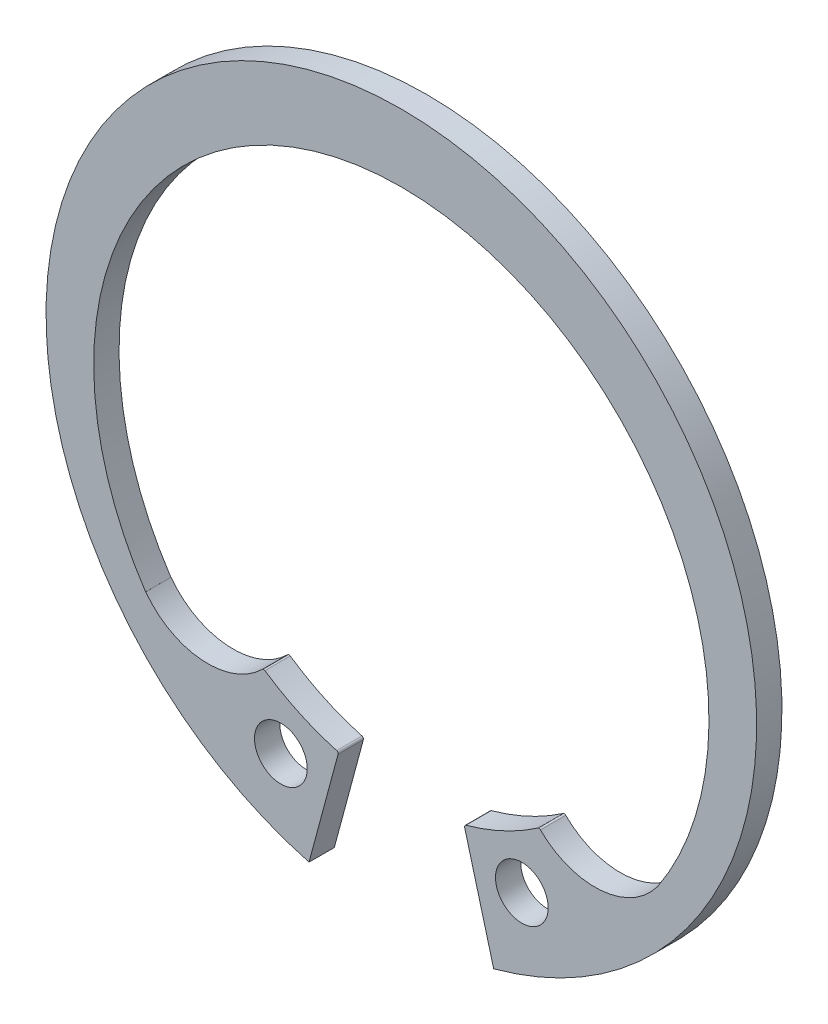
ISO-10303-21;
HEADER;
FILE_DESCRIPTION(('STEP AP214'),'2;1');
FILE_NAME('part.step','',(''),(''),'','','');
FILE_SCHEMA(('AUTOMOTIVE_DESIGN { 1 0 10303 214 1 1 1 1 }'));
ENDSEC;
DATA;
#1=APPLICATION_CONTEXT('core data for automotive mechanical design processes');
#2=APPLICATION_PROTOCOL_DEFINITION('international standard','automotive_design',2000,#1);
#3=PRODUCT_CONTEXT('',#1,'mechanical');
#4=PRODUCT('Part','Part','',(#3));
#5=PRODUCT_RELATED_PRODUCT_CATEGORY('part','',(#4));
#6=PRODUCT_DEFINITION_FORMATION('','',#4);
#7=PRODUCT_DEFINITION_CONTEXT('part definition',#1,'design');
#8=PRODUCT_DEFINITION('design','',#6,#7);
#9=PRODUCT_DEFINITION_SHAPE('','',#8);
#10=(LENGTH_UNIT() NAMED_UNIT(*) SI_UNIT(.MILLI.,.METRE.));
#11=(NAMED_UNIT(*) PLANE_ANGLE_UNIT() SI_UNIT($,.RADIAN.));
#12=(NAMED_UNIT(*) SI_UNIT($,.STERADIAN.) SOLID_ANGLE_UNIT());
#13=UNCERTAINTY_MEASURE_WITH_UNIT(LENGTH_MEASURE(1.E-05),#10,'distance_accuracy_value','');
#14=(GEOMETRIC_REPRESENTATION_CONTEXT(3) GLOBAL_UNCERTAINTY_ASSIGNED_CONTEXT((#13)) GLOBAL_UNIT_ASSIGNED_CONTEXT((#10,
#11,#12)) REPRESENTATION_CONTEXT('',''));
#15=CARTESIAN_POINT('',(0.,0.,0.));
#16=DIRECTION('',(0.,0.,1.));
#17=DIRECTION('',(1.,0.,0.));
#18=AXIS2_PLACEMENT_3D('',#15,#16,#17);
#19=CARTESIAN_POINT('',(0.,0.,-1.2));
#20=DIRECTION('',(0.,0.,1.));
#21=DIRECTION('',(1.,0.,0.));
#22=AXIS2_PLACEMENT_3D('',#19,#20,#21);
#23=CYLINDRICAL_SURFACE('',#22,16.85);
#24=CARTESIAN_POINT('',(0.,0.,-1.2));
#25=DIRECTION('',(0.,0.,1.));
#26=DIRECTION('',(1.,0.,0.));
#27=AXIS2_PLACEMENT_3D('',#24,#25,#26);
#28=CIRCLE('',#27,16.85);
#29=CARTESIAN_POINT('',(4.37879984249977,-16.2710974411477,-1.2));
#30=VERTEX_POINT('',#29);
#31=CARTESIAN_POINT('',(-4.37879984249977,-16.2710974411477,-1.2));
#32=VERTEX_POINT('',#31);
#33=EDGE_CURVE('E146',#30,#32,#28,.T.);
#34=ORIENTED_EDGE('',*,*,#33,.T.);
#35=DIRECTION('',(0.,0.,1.));
#36=VECTOR('',#35,1.);
#37=CARTESIAN_POINT('',(-4.37879984249977,-16.2710974411477,-1.2));
#38=LINE('',#37,#36);
#39=CARTESIAN_POINT('',(-4.37879984249977,-16.2710974411477,0.));
#40=VERTEX_POINT('',#39);
#41=EDGE_CURVE('E36',#32,#40,#38,.T.);
#42=ORIENTED_EDGE('',*,*,#41,.T.);
#43=CARTESIAN_POINT('',(0.,0.,0.));
#44=DIRECTION('',(0.,0.,1.));
#45=DIRECTION('',(1.,0.,0.));
#46=AXIS2_PLACEMENT_3D('',#43,#44,#45);
#47=CIRCLE('',#46,16.85);
#48=CARTESIAN_POINT('',(4.37879984249977,-16.2710974411477,0.));
#49=VERTEX_POINT('',#48);
#50=EDGE_CURVE('E57',#49,#40,#47,.T.);
#51=ORIENTED_EDGE('',*,*,#50,.F.);
#52=DIRECTION('',(0.,0.,1.));
#53=VECTOR('',#52,1.);
#54=CARTESIAN_POINT('',(4.37879984249977,-16.2710974411477,-1.2));
#55=LINE('',#54,#53);
#56=EDGE_CURVE('E11',#30,#49,#55,.T.);
#57=ORIENTED_EDGE('',*,*,#56,.F.);
#58=EDGE_LOOP('',(#34,#42,#51,#57));
#59=FACE_BOUND('',#58,.T.);
#60=ADVANCED_FACE('F33',(#59),#23,.T.);
#61=CARTESIAN_POINT('',(4.37879984249977,-16.2710974411477,-1.2));
#62=DIRECTION('',(-0.965643765053277,-0.259869426854586,0.));
#63=DIRECTION('',(0.259869426854586,-0.965643765053277,0.));
#64=AXIS2_PLACEMENT_3D('',#61,#62,#63);
#65=PLANE('',#64);
#66=DIRECTION('',(0.259869426854586,-0.965643765053277,0.));
#67=VECTOR('',#66,1.);
#68=CARTESIAN_POINT('',(4.37879984249977,-16.2710974411477,0.));
#69=LINE('',#68,#67);
#70=CARTESIAN_POINT('',(3.00137938047477,-11.1527674509272,0.));
#71=VERTEX_POINT('',#70);
#72=EDGE_CURVE('E249',#71,#49,#69,.T.);
#73=ORIENTED_EDGE('',*,*,#72,.F.);
#74=DIRECTION('',(0.,0.,1.));
#75=VECTOR('',#74,1.);
#76=CARTESIAN_POINT('',(3.00137938047477,-11.1527674509272,-1.2));
#77=LINE('',#76,#75);
#78=CARTESIAN_POINT('',(3.00137938047477,-11.1527674509272,-1.2));
#79=VERTEX_POINT('',#78);
#80=EDGE_CURVE('E222',#79,#71,#77,.T.);
#81=ORIENTED_EDGE('',*,*,#80,.F.);
#82=DIRECTION('',(0.259869426854586,-0.965643765053277,0.));
#83=VECTOR('',#82,1.);
#84=CARTESIAN_POINT('',(4.37879984249977,-16.2710974411477,-1.2));
#85=LINE('',#84,#83);
#86=EDGE_CURVE('E252',#79,#30,#85,.T.);
#87=ORIENTED_EDGE('',*,*,#86,.T.);
#88=ORIENTED_EDGE('',*,*,#56,.T.);
#89=EDGE_LOOP('',(#73,#81,#87,#88));
#90=FACE_BOUND('',#89,.T.);
#91=ADVANCED_FACE('F265',(#90),#65,.T.);
#92=CARTESIAN_POINT('',(0.,-0.938821108372822,-1.2));
#93=DIRECTION('',(0.,0.,1.));
#94=DIRECTION('',(1.,0.,0.));
#95=AXIS2_PLACEMENT_3D('',#92,#93,#94);
#96=CYLINDRICAL_SURFACE('',#95,14.5888211083728);
#97=DIRECTION('',(0.,0.,1.));
#98=VECTOR('',#97,1.);
#99=CARTESIAN_POINT('',(-12.1286137504347,-9.04625163998214,-1.2));
#100=LINE('',#99,#98);
#101=CARTESIAN_POINT('',(-12.1286137504347,-9.04625163998214,-1.2));
#102=VERTEX_POINT('',#101);
#103=CARTESIAN_POINT('',(-12.1286137504347,-9.04625163998214,0.));
#104=VERTEX_POINT('',#103);
#105=EDGE_CURVE('E187',#102,#104,#100,.T.);
#106=ORIENTED_EDGE('',*,*,#105,.F.);
#107=CARTESIAN_POINT('',(0.,-0.938821108372822,-1.2));
#108=DIRECTION('',(0.,0.,-1.));
#109=DIRECTION('',(1.,0.,0.));
#110=AXIS2_PLACEMENT_3D('',#107,#108,#109);
#111=CIRCLE('',#110,14.5888211083728);
#112=CARTESIAN_POINT('',(12.1286137504347,-9.04625163998214,-1.2));
#113=VERTEX_POINT('',#112);
#114=EDGE_CURVE('E65',#102,#113,#111,.T.);
#115=ORIENTED_EDGE('',*,*,#114,.T.);
#116=DIRECTION('',(0.,0.,1.));
#117=VECTOR('',#116,1.);
#118=CARTESIAN_POINT('',(12.1286137504347,-9.04625163998214,-1.2));
#119=LINE('',#118,#117);
#120=CARTESIAN_POINT('',(12.1286137504347,-9.04625163998214,0.));
#121=VERTEX_POINT('',#120);
#122=EDGE_CURVE('E225',#121,#113,#119,.F.);
#123=ORIENTED_EDGE('',*,*,#122,.F.);
#124=CARTESIAN_POINT('',(0.,-0.938821108372822,0.));
#125=DIRECTION('',(0.,0.,-1.));
#126=DIRECTION('',(1.,0.,0.));
#127=AXIS2_PLACEMENT_3D('',#124,#125,#126);
#128=CIRCLE('',#127,14.5888211083728);
#129=EDGE_CURVE('E258',#104,#121,#128,.T.);
#130=ORIENTED_EDGE('',*,*,#129,.F.);
#131=EDGE_LOOP('',(#106,#115,#123,#130));
#132=FACE_BOUND('',#131,.T.);
#133=ADVANCED_FACE('F287',(#132),#96,.F.);
#134=CARTESIAN_POINT('',(-4.37879984249977,-16.2710974411477,-1.2));
#135=DIRECTION('',(0.965643765053277,-0.259869426854586,0.));
#136=DIRECTION('',(0.259869426854586,0.965643765053277,0.));
#137=AXIS2_PLACEMENT_3D('',#134,#135,#136);
#138=PLANE('',#137);
#139=DIRECTION('',(0.259869426854586,0.965643765053277,0.));
#140=VECTOR('',#139,1.);
#141=CARTESIAN_POINT('',(-4.37879984249977,-16.2710974411477,0.));
#142=LINE('',#141,#140);
#143=CARTESIAN_POINT('',(-3.00137938047477,-11.1527674509272,0.));
#144=VERTEX_POINT('',#143);
#145=EDGE_CURVE('E256',#40,#144,#142,.T.);
#146=ORIENTED_EDGE('',*,*,#145,.F.);
#147=ORIENTED_EDGE('',*,*,#41,.F.);
#148=DIRECTION('',(0.259869426854586,0.965643765053277,0.));
#149=VECTOR('',#148,1.);
#150=CARTESIAN_POINT('',(-4.37879984249977,-16.2710974411477,-1.2));
#151=LINE('',#150,#149);
#152=CARTESIAN_POINT('',(-3.00137938047477,-11.1527674509272,-1.2));
#153=VERTEX_POINT('',#152);
#154=EDGE_CURVE('E138',#32,#153,#151,.T.);
#155=ORIENTED_EDGE('',*,*,#154,.T.);
#156=DIRECTION('',(0.,0.,1.));
#157=VECTOR('',#156,1.);
#158=CARTESIAN_POINT('',(-3.00137938047477,-11.1527674509272,-1.2));
#159=LINE('',#158,#157);
#160=EDGE_CURVE('E142',#153,#144,#159,.T.);
#161=ORIENTED_EDGE('',*,*,#160,.T.);
#162=EDGE_LOOP('',(#146,#147,#155,#161));
#163=FACE_BOUND('',#162,.T.);
#164=ADVANCED_FACE('F141',(#163),#138,.T.);
#165=CARTESIAN_POINT('',(0.,0.,-1.2));
#166=DIRECTION('',(0.,0.,1.));
#167=DIRECTION('',(1.,0.,0.));
#168=AXIS2_PLACEMENT_3D('',#165,#166,#167);
#169=PLANE('',#168);
#170=ORIENTED_EDGE('',*,*,#114,.F.);
#171=DIRECTION('',(-0.801589980532698,-0.597874153237609,0.));
#172=VECTOR('',#171,1.);
#173=CARTESIAN_POINT('',(-13.506791171976,-10.0741794820537,-1.2));
#174=LINE('',#173,#172);
#175=CARTESIAN_POINT('',(-12.1233619181029,-9.04233450667883,-1.2));
#176=VERTEX_POINT('',#175);
#177=EDGE_CURVE('E156',#176,#102,#174,.T.);
#178=ORIENTED_EDGE('',*,*,#177,.F.);
#179=CARTESIAN_POINT('',(-9.17820527709939,-6.84565905457063,-1.2));
#180=DIRECTION('',(0.,0.,-1.));
#181=DIRECTION('',(1.,0.,0.));
#182=AXIS2_PLACEMENT_3D('',#179,#180,#181);
#183=CIRCLE('',#182,3.67414353039475);
#184=CARTESIAN_POINT('',(-6.59559305403814,-9.45897969835626,-1.2));
#185=VERTEX_POINT('',#184);
#186=EDGE_CURVE('E173',#185,#176,#183,.T.);
#187=ORIENTED_EDGE('',*,*,#186,.F.);
#188=CARTESIAN_POINT('',(-6.52530150985386,-9.53010704061077,-1.2));
#189=DIRECTION('',(0.,0.,1.));
#190=DIRECTION('',(1.,0.,0.));
#191=AXIS2_PLACEMENT_3D('',#188,#189,#190);
#192=CIRCLE('',#191,0.0999999999999997);
#193=CARTESIAN_POINT('',(-6.46880539288543,-9.44759529134142,-1.2));
#194=VERTEX_POINT('',#193);
#195=EDGE_CURVE('E165',#194,#185,#192,.T.);
#196=ORIENTED_EDGE('',*,*,#195,.F.);
#197=CARTESIAN_POINT('',(0.,0.,-1.2));
#198=DIRECTION('',(0.,0.,-1.));
#199=DIRECTION('',(1.,0.,0.));
#200=AXIS2_PLACEMENT_3D('',#197,#198,#199);
#201=CIRCLE('',#200,11.45);
#202=CARTESIAN_POINT('',(-3.07112173311014,-11.0304447462656,-1.2));
#203=VERTEX_POINT('',#202);
#204=EDGE_CURVE('E161',#203,#194,#201,.T.);
#205=ORIENTED_EDGE('',*,*,#204,.F.);
#206=CARTESIAN_POINT('',(-3.09794375698009,-11.1267805082417,-1.2));
#207=DIRECTION('',(0.,0.,1.));
#208=DIRECTION('',(-1.,0.,0.));
#209=AXIS2_PLACEMENT_3D('',#206,#207,#208);
#210=CIRCLE('',#209,0.0999999999999995);
#211=EDGE_CURVE('E152',#153,#203,#210,.T.);
#212=ORIENTED_EDGE('',*,*,#211,.F.);
#213=ORIENTED_EDGE('',*,*,#154,.F.);
#214=ORIENTED_EDGE('',*,*,#33,.F.);
#215=ORIENTED_EDGE('',*,*,#86,.F.);
#216=CARTESIAN_POINT('',(3.0979437569801,-11.1267805082417,-1.2));
#217=DIRECTION('',(0.,0.,1.));
#218=DIRECTION('',(1.,0.,0.));
#219=AXIS2_PLACEMENT_3D('',#216,#217,#218);
#220=CIRCLE('',#219,0.100000000000001);
#221=CARTESIAN_POINT('',(3.07112173311014,-11.0304447462656,-1.2));
#222=VERTEX_POINT('',#221);
#223=EDGE_CURVE('E207',#222,#79,#220,.T.);
#224=ORIENTED_EDGE('',*,*,#223,.F.);
#225=CARTESIAN_POINT('',(0.,0.,-1.2));
#226=DIRECTION('',(0.,0.,-1.));
#227=DIRECTION('',(1.,0.,0.));
#228=AXIS2_PLACEMENT_3D('',#225,#226,#227);
#229=CIRCLE('',#228,11.45);
#230=CARTESIAN_POINT('',(6.46880539288542,-9.44759529134142,-1.2));
#231=VERTEX_POINT('',#230);
#232=EDGE_CURVE('E205',#231,#222,#229,.T.);
#233=ORIENTED_EDGE('',*,*,#232,.F.);
#234=CARTESIAN_POINT('',(6.52530150985386,-9.53010704061077,-1.2));
#235=DIRECTION('',(0.,0.,1.));
#236=DIRECTION('',(-1.,0.,0.));
#237=AXIS2_PLACEMENT_3D('',#234,#235,#236);
#238=CIRCLE('',#237,0.0999999999999997);
#239=CARTESIAN_POINT('',(6.59559305403814,-9.45897969835626,-1.2));
#240=VERTEX_POINT('',#239);
#241=EDGE_CURVE('E202',#240,#231,#238,.T.);
#242=ORIENTED_EDGE('',*,*,#241,.F.);
#243=CARTESIAN_POINT('',(9.17820527709939,-6.84565905457063,-1.2));
#244=DIRECTION('',(0.,0.,-1.));
#245=DIRECTION('',(1.,0.,0.));
#246=AXIS2_PLACEMENT_3D('',#243,#244,#245);
#247=CIRCLE('',#246,3.67414353039475);
#248=CARTESIAN_POINT('',(12.1233619181029,-9.04233450667883,-1.2));
#249=VERTEX_POINT('',#248);
#250=EDGE_CURVE('E198',#249,#240,#247,.T.);
#251=ORIENTED_EDGE('',*,*,#250,.F.);
#252=DIRECTION('',(-0.801589980532698,0.597874153237609,0.));
#253=VECTOR('',#252,1.);
#254=CARTESIAN_POINT('',(12.1233619181029,-9.04233450667883,-1.2));
#255=LINE('',#254,#253);
#256=EDGE_CURVE('E196',#113,#249,#255,.T.);
#257=ORIENTED_EDGE('',*,*,#256,.F.);
#258=EDGE_LOOP('',(#170,#178,#187,#196,#205,#212,#213,#214,#215,#224,#233,#242,#251,#257));
#259=FACE_BOUND('',#258,.T.);
#260=CARTESIAN_POINT('',(5.7142084974275,-12.4789200753882,-1.2));
#261=DIRECTION('',(0.,0.,1.));
#262=DIRECTION('',(1.,0.,0.));
#263=AXIS2_PLACEMENT_3D('',#260,#261,#262);
#264=CIRCLE('',#263,1.25);
#265=CARTESIAN_POINT('',(6.9642084974275,-12.4789200753882,-1.2));
#266=VERTEX_POINT('',#265);
#267=EDGE_CURVE('E244',#266,#266,#264,.T.);
#268=ORIENTED_EDGE('',*,*,#267,.T.);
#269=EDGE_LOOP('',(#268));
#270=FACE_BOUND('',#269,.T.);
#271=CARTESIAN_POINT('',(-5.7142084974275,-12.4789200753882,-1.2));
#272=DIRECTION('',(0.,0.,1.));
#273=DIRECTION('',(1.,0.,0.));
#274=AXIS2_PLACEMENT_3D('',#271,#272,#273);
#275=CIRCLE('',#274,1.25);
#276=CARTESIAN_POINT('',(-4.4642084974275,-12.4789200753882,-1.2));
#277=VERTEX_POINT('',#276);
#278=EDGE_CURVE('E238',#277,#277,#275,.T.);
#279=ORIENTED_EDGE('',*,*,#278,.T.);
#280=EDGE_LOOP('',(#279));
#281=FACE_BOUND('',#280,.T.);
#282=ADVANCED_FACE('F158',(#259,#270,#281),#169,.F.);
#283=CARTESIAN_POINT('',(0.,0.,0.));
#284=DIRECTION('',(0.,0.,1.));
#285=DIRECTION('',(1.,0.,0.));
#286=AXIS2_PLACEMENT_3D('',#283,#284,#285);
#287=PLANE('',#286);
#288=DIRECTION('',(-0.801589980532698,-0.597874153237609,0.));
#289=VECTOR('',#288,1.);
#290=CARTESIAN_POINT('',(-13.506791171976,-10.0741794820537,0.));
#291=LINE('',#290,#289);
#292=CARTESIAN_POINT('',(-12.1233619181029,-9.04233450667883,0.));
#293=VERTEX_POINT('',#292);
#294=EDGE_CURVE('E163',#293,#104,#291,.T.);
#295=ORIENTED_EDGE('',*,*,#294,.T.);
#296=ORIENTED_EDGE('',*,*,#129,.T.);
#297=DIRECTION('',(-0.801589980532698,0.597874153237609,0.));
#298=VECTOR('',#297,1.);
#299=CARTESIAN_POINT('',(12.1233619181029,-9.04233450667883,0.));
#300=LINE('',#299,#298);
#301=CARTESIAN_POINT('',(12.1233619181029,-9.04233450667883,0.));
#302=VERTEX_POINT('',#301);
#303=EDGE_CURVE('E195',#121,#302,#300,.T.);
#304=ORIENTED_EDGE('',*,*,#303,.T.);
#305=CARTESIAN_POINT('',(9.17820527709939,-6.84565905457063,0.));
#306=DIRECTION('',(0.,0.,-1.));
#307=DIRECTION('',(1.,0.,0.));
#308=AXIS2_PLACEMENT_3D('',#305,#306,#307);
#309=CIRCLE('',#308,3.67414353039475);
#310=CARTESIAN_POINT('',(6.59559305403814,-9.45897969835626,0.));
#311=VERTEX_POINT('',#310);
#312=EDGE_CURVE('E212',#302,#311,#309,.T.);
#313=ORIENTED_EDGE('',*,*,#312,.T.);
#314=CARTESIAN_POINT('',(6.52530150985386,-9.53010704061077,0.));
#315=DIRECTION('',(0.,0.,1.));
#316=DIRECTION('',(-1.,0.,0.));
#317=AXIS2_PLACEMENT_3D('',#314,#315,#316);
#318=CIRCLE('',#317,0.0999999999999997);
#319=CARTESIAN_POINT('',(6.46880539288542,-9.44759529134142,0.));
#320=VERTEX_POINT('',#319);
#321=EDGE_CURVE('E215',#311,#320,#318,.T.);
#322=ORIENTED_EDGE('',*,*,#321,.T.);
#323=CARTESIAN_POINT('',(0.,0.,0.));
#324=DIRECTION('',(0.,0.,-1.));
#325=DIRECTION('',(1.,0.,0.));
#326=AXIS2_PLACEMENT_3D('',#323,#324,#325);
#327=CIRCLE('',#326,11.45);
#328=CARTESIAN_POINT('',(3.07112173311014,-11.0304447462656,0.));
#329=VERTEX_POINT('',#328);
#330=EDGE_CURVE('E218',#320,#329,#327,.T.);
#331=ORIENTED_EDGE('',*,*,#330,.T.);
#332=CARTESIAN_POINT('',(3.0979437569801,-11.1267805082417,0.));
#333=DIRECTION('',(0.,0.,1.));
#334=DIRECTION('',(1.,0.,0.));
#335=AXIS2_PLACEMENT_3D('',#332,#333,#334);
#336=CIRCLE('',#335,0.100000000000001);
#337=EDGE_CURVE('E199',#329,#71,#336,.T.);
#338=ORIENTED_EDGE('',*,*,#337,.T.);
#339=ORIENTED_EDGE('',*,*,#72,.T.);
#340=ORIENTED_EDGE('',*,*,#50,.T.);
#341=ORIENTED_EDGE('',*,*,#145,.T.);
#342=CARTESIAN_POINT('',(-3.09794375698009,-11.1267805082417,0.));
#343=DIRECTION('',(0.,0.,1.));
#344=DIRECTION('',(-1.,0.,0.));
#345=AXIS2_PLACEMENT_3D('',#342,#343,#344);
#346=CIRCLE('',#345,0.0999999999999995);
#347=CARTESIAN_POINT('',(-3.07112173311014,-11.0304447462656,0.));
#348=VERTEX_POINT('',#347);
#349=EDGE_CURVE('E154',#144,#348,#346,.T.);
#350=ORIENTED_EDGE('',*,*,#349,.T.);
#351=CARTESIAN_POINT('',(0.,0.,0.));
#352=DIRECTION('',(0.,0.,-1.));
#353=DIRECTION('',(1.,0.,0.));
#354=AXIS2_PLACEMENT_3D('',#351,#352,#353);
#355=CIRCLE('',#354,11.45);
#356=CARTESIAN_POINT('',(-6.46880539288543,-9.44759529134142,0.));
#357=VERTEX_POINT('',#356);
#358=EDGE_CURVE('E178',#348,#357,#355,.T.);
#359=ORIENTED_EDGE('',*,*,#358,.T.);
#360=CARTESIAN_POINT('',(-6.52530150985386,-9.53010704061077,0.));
#361=DIRECTION('',(0.,0.,1.));
#362=DIRECTION('',(1.,0.,0.));
#363=AXIS2_PLACEMENT_3D('',#360,#361,#362);
#364=CIRCLE('',#363,0.0999999999999997);
#365=CARTESIAN_POINT('',(-6.59559305403814,-9.45897969835626,0.));
#366=VERTEX_POINT('',#365);
#367=EDGE_CURVE('E180',#357,#366,#364,.T.);
#368=ORIENTED_EDGE('',*,*,#367,.T.);
#369=CARTESIAN_POINT('',(-9.17820527709939,-6.84565905457063,0.));
#370=DIRECTION('',(0.,0.,-1.));
#371=DIRECTION('',(1.,0.,0.));
#372=AXIS2_PLACEMENT_3D('',#369,#370,#371);
#373=CIRCLE('',#372,3.67414353039475);
#374=EDGE_CURVE('E168',#366,#293,#373,.T.);
#375=ORIENTED_EDGE('',*,*,#374,.T.);
#376=EDGE_LOOP('',(#295,#296,#304,#313,#322,#331,#338,#339,#340,#341,#350,#359,#368,#375));
#377=FACE_BOUND('',#376,.T.);
#378=CARTESIAN_POINT('',(5.7142084974275,-12.4789200753882,0.));
#379=DIRECTION('',(0.,0.,1.));
#380=DIRECTION('',(1.,0.,0.));
#381=AXIS2_PLACEMENT_3D('',#378,#379,#380);
#382=CIRCLE('',#381,1.25);
#383=CARTESIAN_POINT('',(6.9642084974275,-12.4789200753882,0.));
#384=VERTEX_POINT('',#383);
#385=EDGE_CURVE('E241',#384,#384,#382,.T.);
#386=ORIENTED_EDGE('',*,*,#385,.F.);
#387=EDGE_LOOP('',(#386));
#388=FACE_BOUND('',#387,.T.);
#389=CARTESIAN_POINT('',(-5.7142084974275,-12.4789200753882,0.));
#390=DIRECTION('',(0.,0.,1.));
#391=DIRECTION('',(1.,0.,0.));
#392=AXIS2_PLACEMENT_3D('',#389,#390,#391);
#393=CIRCLE('',#392,1.25);
#394=CARTESIAN_POINT('',(-4.4642084974275,-12.4789200753882,0.));
#395=VERTEX_POINT('',#394);
#396=EDGE_CURVE('E237',#395,#395,#393,.T.);
#397=ORIENTED_EDGE('',*,*,#396,.F.);
#398=EDGE_LOOP('',(#397));
#399=FACE_BOUND('',#398,.T.);
#400=ADVANCED_FACE('F260',(#377,#388,#399),#287,.T.);
#401=CARTESIAN_POINT('',(5.7142084974275,-12.4789200753882,-1.2));
#402=DIRECTION('',(0.,0.,1.));
#403=DIRECTION('',(1.,0.,0.));
#404=AXIS2_PLACEMENT_3D('',#401,#402,#403);
#405=CYLINDRICAL_SURFACE('',#404,1.25);
#406=ORIENTED_EDGE('',*,*,#267,.F.);
#407=EDGE_LOOP('',(#406));
#408=FACE_BOUND('',#407,.T.);
#409=ORIENTED_EDGE('',*,*,#385,.T.);
#410=EDGE_LOOP('',(#409));
#411=FACE_BOUND('',#410,.T.);
#412=ADVANCED_FACE('F310',(#408,#411),#405,.F.);
#413=CARTESIAN_POINT('',(-5.7142084974275,-12.4789200753882,-1.2));
#414=DIRECTION('',(0.,0.,1.));
#415=DIRECTION('',(1.,0.,0.));
#416=AXIS2_PLACEMENT_3D('',#413,#414,#415);
#417=CYLINDRICAL_SURFACE('',#416,1.25);
#418=ORIENTED_EDGE('',*,*,#278,.F.);
#419=EDGE_LOOP('',(#418));
#420=FACE_BOUND('',#419,.T.);
#421=ORIENTED_EDGE('',*,*,#396,.T.);
#422=EDGE_LOOP('',(#421));
#423=FACE_BOUND('',#422,.T.);
#424=ADVANCED_FACE('F303',(#420,#423),#417,.F.);
#425=CARTESIAN_POINT('',(0.,0.,-1.2));
#426=DIRECTION('',(0.,0.,1.));
#427=DIRECTION('',(1.,0.,0.));
#428=AXIS2_PLACEMENT_3D('',#425,#426,#427);
#429=CYLINDRICAL_SURFACE('',#428,11.45);
#430=ORIENTED_EDGE('',*,*,#330,.F.);
#431=DIRECTION('',(0.,0.,1.));
#432=VECTOR('',#431,1.);
#433=CARTESIAN_POINT('',(6.46880539288542,-9.44759529134142,-1.2));
#434=LINE('',#433,#432);
#435=EDGE_CURVE('E229',#231,#320,#434,.T.);
#436=ORIENTED_EDGE('',*,*,#435,.F.);
#437=ORIENTED_EDGE('',*,*,#232,.T.);
#438=DIRECTION('',(0.,0.,1.));
#439=VECTOR('',#438,1.);
#440=CARTESIAN_POINT('',(3.07112173311014,-11.0304447462656,-1.2));
#441=LINE('',#440,#439);
#442=EDGE_CURVE('E226',#222,#329,#441,.T.);
#443=ORIENTED_EDGE('',*,*,#442,.T.);
#444=EDGE_LOOP('',(#430,#436,#437,#443));
#445=FACE_BOUND('',#444,.T.);
#446=ADVANCED_FACE('F301',(#445),#429,.F.);
#447=CARTESIAN_POINT('',(3.0979437569801,-11.1267805082417,-1.2));
#448=DIRECTION('',(0.,0.,1.));
#449=DIRECTION('',(1.,0.,0.));
#450=AXIS2_PLACEMENT_3D('',#447,#448,#449);
#451=CYLINDRICAL_SURFACE('',#450,0.100000000000001);
#452=ORIENTED_EDGE('',*,*,#337,.F.);
#453=ORIENTED_EDGE('',*,*,#442,.F.);
#454=ORIENTED_EDGE('',*,*,#223,.T.);
#455=ORIENTED_EDGE('',*,*,#80,.T.);
#456=EDGE_LOOP('',(#452,#453,#454,#455));
#457=FACE_BOUND('',#456,.T.);
#458=ADVANCED_FACE('F267',(#457),#451,.T.);
#459=CARTESIAN_POINT('',(6.52530150985386,-9.53010704061077,-1.2));
#460=DIRECTION('',(0.,0.,1.));
#461=DIRECTION('',(1.,0.,0.));
#462=AXIS2_PLACEMENT_3D('',#459,#460,#461);
#463=CYLINDRICAL_SURFACE('',#462,0.0999999999999997);
#464=ORIENTED_EDGE('',*,*,#321,.F.);
#465=DIRECTION('',(0.,0.,1.));
#466=VECTOR('',#465,1.);
#467=CARTESIAN_POINT('',(6.59559305403814,-9.45897969835626,-1.2));
#468=LINE('',#467,#466);
#469=EDGE_CURVE('E232',#240,#311,#468,.T.);
#470=ORIENTED_EDGE('',*,*,#469,.F.);
#471=ORIENTED_EDGE('',*,*,#241,.T.);
#472=ORIENTED_EDGE('',*,*,#435,.T.);
#473=EDGE_LOOP('',(#464,#470,#471,#472));
#474=FACE_BOUND('',#473,.T.);
#475=ADVANCED_FACE('F299',(#474),#463,.T.);
#476=CARTESIAN_POINT('',(9.17820527709939,-6.84565905457063,-1.2));
#477=DIRECTION('',(0.,0.,1.));
#478=DIRECTION('',(1.,0.,0.));
#479=AXIS2_PLACEMENT_3D('',#476,#477,#478);
#480=CYLINDRICAL_SURFACE('',#479,3.67414353039475);
#481=ORIENTED_EDGE('',*,*,#312,.F.);
#482=DIRECTION('',(0.,0.,1.));
#483=VECTOR('',#482,1.);
#484=CARTESIAN_POINT('',(12.1233619181029,-9.04233450667883,-1.2));
#485=LINE('',#484,#483);
#486=EDGE_CURVE('E210',#249,#302,#485,.T.);
#487=ORIENTED_EDGE('',*,*,#486,.F.);
#488=ORIENTED_EDGE('',*,*,#250,.T.);
#489=ORIENTED_EDGE('',*,*,#469,.T.);
#490=EDGE_LOOP('',(#481,#487,#488,#489));
#491=FACE_BOUND('',#490,.T.);
#492=ADVANCED_FACE('F296',(#491),#480,.F.);
#493=CARTESIAN_POINT('',(12.1233619181029,-9.04233450667883,-1.2));
#494=DIRECTION('',(0.597874153237609,0.801589980532698,0.));
#495=DIRECTION('',(-0.801589980532698,0.597874153237609,0.));
#496=AXIS2_PLACEMENT_3D('',#493,#494,#495);
#497=PLANE('',#496);
#498=ORIENTED_EDGE('',*,*,#303,.F.);
#499=ORIENTED_EDGE('',*,*,#122,.T.);
#500=ORIENTED_EDGE('',*,*,#256,.T.);
#501=ORIENTED_EDGE('',*,*,#486,.T.);
#502=EDGE_LOOP('',(#498,#499,#500,#501));
#503=FACE_BOUND('',#502,.T.);
#504=ADVANCED_FACE('F293',(#503),#497,.T.);
#505=CARTESIAN_POINT('',(0.,0.,-1.2));
#506=DIRECTION('',(0.,0.,1.));
#507=DIRECTION('',(1.,0.,0.));
#508=AXIS2_PLACEMENT_3D('',#505,#506,#507);
#509=CYLINDRICAL_SURFACE('',#508,11.45);
#510=ORIENTED_EDGE('',*,*,#358,.F.);
#511=DIRECTION('',(0.,0.,1.));
#512=VECTOR('',#511,1.);
#513=CARTESIAN_POINT('',(-3.07112173311014,-11.0304447462656,-1.2));
#514=LINE('',#513,#512);
#515=EDGE_CURVE('E155',#203,#348,#514,.T.);
#516=ORIENTED_EDGE('',*,*,#515,.F.);
#517=ORIENTED_EDGE('',*,*,#204,.T.);
#518=DIRECTION('',(0.,0.,1.));
#519=VECTOR('',#518,1.);
#520=CARTESIAN_POINT('',(-6.46880539288543,-9.44759529134142,-1.2));
#521=LINE('',#520,#519);
#522=EDGE_CURVE('E190',#194,#357,#521,.T.);
#523=ORIENTED_EDGE('',*,*,#522,.T.);
#524=EDGE_LOOP('',(#510,#516,#517,#523));
#525=FACE_BOUND('',#524,.T.);
#526=ADVANCED_FACE('F275',(#525),#509,.F.);
#527=CARTESIAN_POINT('',(-13.506791171976,-10.0741794820537,-1.2));
#528=DIRECTION('',(-0.597874153237609,0.801589980532698,0.));
#529=DIRECTION('',(-0.801589980532698,-0.597874153237609,0.));
#530=AXIS2_PLACEMENT_3D('',#527,#528,#529);
#531=PLANE('',#530);
#532=ORIENTED_EDGE('',*,*,#177,.T.);
#533=ORIENTED_EDGE('',*,*,#105,.T.);
#534=ORIENTED_EDGE('',*,*,#294,.F.);
#535=DIRECTION('',(0.,0.,1.));
#536=VECTOR('',#535,1.);
#537=CARTESIAN_POINT('',(-12.1233619181029,-9.04233450667883,-1.2));
#538=LINE('',#537,#536);
#539=EDGE_CURVE('E185',#176,#293,#538,.T.);
#540=ORIENTED_EDGE('',*,*,#539,.F.);
#541=EDGE_LOOP('',(#532,#533,#534,#540));
#542=FACE_BOUND('',#541,.T.);
#543=ADVANCED_FACE('F285',(#542),#531,.T.);
#544=CARTESIAN_POINT('',(-9.17820527709939,-6.84565905457063,-1.2));
#545=DIRECTION('',(0.,0.,1.));
#546=DIRECTION('',(1.,0.,0.));
#547=AXIS2_PLACEMENT_3D('',#544,#545,#546);
#548=CYLINDRICAL_SURFACE('',#547,3.67414353039475);
#549=ORIENTED_EDGE('',*,*,#374,.F.);
#550=DIRECTION('',(0.,0.,1.));
#551=VECTOR('',#550,1.);
#552=CARTESIAN_POINT('',(-6.59559305403814,-9.45897969835626,-1.2));
#553=LINE('',#552,#551);
#554=EDGE_CURVE('E188',#185,#366,#553,.T.);
#555=ORIENTED_EDGE('',*,*,#554,.F.);
#556=ORIENTED_EDGE('',*,*,#186,.T.);
#557=ORIENTED_EDGE('',*,*,#539,.T.);
#558=EDGE_LOOP('',(#549,#555,#556,#557));
#559=FACE_BOUND('',#558,.T.);
#560=ADVANCED_FACE('F281',(#559),#548,.F.);
#561=CARTESIAN_POINT('',(-6.52530150985386,-9.53010704061077,-1.2));
#562=DIRECTION('',(0.,0.,1.));
#563=DIRECTION('',(1.,0.,0.));
#564=AXIS2_PLACEMENT_3D('',#561,#562,#563);
#565=CYLINDRICAL_SURFACE('',#564,0.0999999999999997);
#566=ORIENTED_EDGE('',*,*,#367,.F.);
#567=ORIENTED_EDGE('',*,*,#522,.F.);
#568=ORIENTED_EDGE('',*,*,#195,.T.);
#569=ORIENTED_EDGE('',*,*,#554,.T.);
#570=EDGE_LOOP('',(#566,#567,#568,#569));
#571=FACE_BOUND('',#570,.T.);
#572=ADVANCED_FACE('F277',(#571),#565,.T.);
#573=CARTESIAN_POINT('',(-3.09794375698009,-11.1267805082417,-1.2));
#574=DIRECTION('',(0.,0.,1.));
#575=DIRECTION('',(1.,0.,0.));
#576=AXIS2_PLACEMENT_3D('',#573,#574,#575);
#577=CYLINDRICAL_SURFACE('',#576,0.0999999999999995);
#578=ORIENTED_EDGE('',*,*,#349,.F.);
#579=ORIENTED_EDGE('',*,*,#160,.F.);
#580=ORIENTED_EDGE('',*,*,#211,.T.);
#581=ORIENTED_EDGE('',*,*,#515,.T.);
#582=EDGE_LOOP('',(#578,#579,#580,#581));
#583=FACE_BOUND('',#582,.T.);
#584=ADVANCED_FACE('F150',(#583),#577,.T.);
#585=CLOSED_SHELL('',(#60,#91,#133,#164,#282,#400,#412,#424,#446,#458,#475,#492,#504,#526,#543,
#560,#572,#584));
#586=MANIFOLD_SOLID_BREP('B2',#585);
#587=ADVANCED_BREP_SHAPE_REPRESENTATION('',(#18,#586),#14);
#588=SHAPE_DEFINITION_REPRESENTATION(#9,#587);
ENDSEC;
END-ISO-10303-21;
